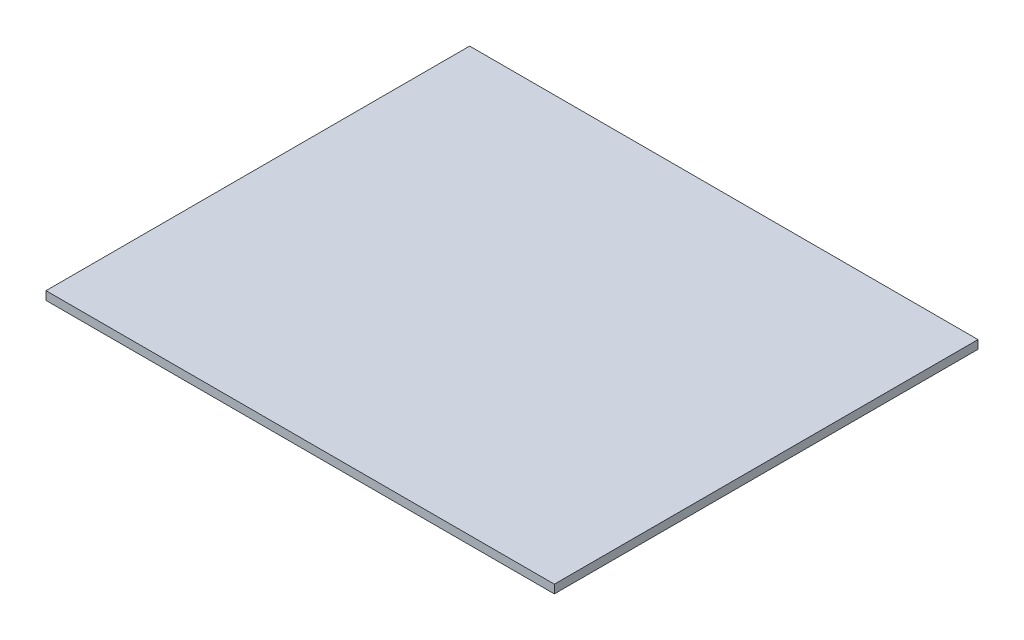
ISO-10303-21;
HEADER;
FILE_DESCRIPTION(('STEP AP214'),'2;1');
FILE_NAME('part.step','',(''),(''),'','','');
FILE_SCHEMA(('AUTOMOTIVE_DESIGN { 1 0 10303 214 1 1 1 1 }'));
ENDSEC;
DATA;
#1=APPLICATION_CONTEXT('core data for automotive mechanical design processes');
#2=APPLICATION_PROTOCOL_DEFINITION('international standard','automotive_design',2000,#1);
#3=PRODUCT_CONTEXT('',#1,'mechanical');
#4=PRODUCT('Part','Part','',(#3));
#5=PRODUCT_RELATED_PRODUCT_CATEGORY('part','',(#4));
#6=PRODUCT_DEFINITION_FORMATION('','',#4);
#7=PRODUCT_DEFINITION_CONTEXT('part definition',#1,'design');
#8=PRODUCT_DEFINITION('design','',#6,#7);
#9=PRODUCT_DEFINITION_SHAPE('','',#8);
#10=(LENGTH_UNIT() NAMED_UNIT(*) SI_UNIT(.MILLI.,.METRE.));
#11=(NAMED_UNIT(*) PLANE_ANGLE_UNIT() SI_UNIT($,.RADIAN.));
#12=(NAMED_UNIT(*) SI_UNIT($,.STERADIAN.) SOLID_ANGLE_UNIT());
#13=UNCERTAINTY_MEASURE_WITH_UNIT(LENGTH_MEASURE(1.E-05),#10,'distance_accuracy_value','');
#14=(GEOMETRIC_REPRESENTATION_CONTEXT(3) GLOBAL_UNCERTAINTY_ASSIGNED_CONTEXT((#13)) GLOBAL_UNIT_ASSIGNED_CONTEXT((#10,
#11,#12)) REPRESENTATION_CONTEXT('',''));
#15=CARTESIAN_POINT('',(0.,0.,0.));
#16=DIRECTION('',(0.,0.,1.));
#17=DIRECTION('',(1.,0.,0.));
#18=AXIS2_PLACEMENT_3D('',#15,#16,#17);
#19=CARTESIAN_POINT('',(-300.,10.,-250.));
#20=DIRECTION('',(1.,0.,0.));
#21=DIRECTION('',(0.,0.,-1.));
#22=AXIS2_PLACEMENT_3D('',#19,#20,#21);
#23=PLANE('',#22);
#24=DIRECTION('',(0.,0.,1.));
#25=VECTOR('',#24,1.);
#26=CARTESIAN_POINT('',(-300.,0.,-250.));
#27=LINE('',#26,#25);
#28=CARTESIAN_POINT('',(-300.,0.,-250.));
#29=VERTEX_POINT('',#28);
#30=CARTESIAN_POINT('',(-300.,0.,250.));
#31=VERTEX_POINT('',#30);
#32=EDGE_CURVE('E95',#29,#31,#27,.T.);
#33=ORIENTED_EDGE('',*,*,#32,.T.);
#34=DIRECTION('',(0.,-1.,0.));
#35=VECTOR('',#34,1.);
#36=CARTESIAN_POINT('',(-300.,10.,250.));
#37=LINE('',#36,#35);
#38=CARTESIAN_POINT('',(-300.,10.,250.));
#39=VERTEX_POINT('',#38);
#40=EDGE_CURVE('E11',#39,#31,#37,.T.);
#41=ORIENTED_EDGE('',*,*,#40,.F.);
#42=DIRECTION('',(0.,0.,1.));
#43=VECTOR('',#42,1.);
#44=CARTESIAN_POINT('',(-300.,10.,-250.));
#45=LINE('',#44,#43);
#46=CARTESIAN_POINT('',(-300.,10.,-250.));
#47=VERTEX_POINT('',#46);
#48=EDGE_CURVE('E81',#47,#39,#45,.T.);
#49=ORIENTED_EDGE('',*,*,#48,.F.);
#50=DIRECTION('',(0.,-1.,0.));
#51=VECTOR('',#50,1.);
#52=CARTESIAN_POINT('',(-300.,10.,-250.));
#53=LINE('',#52,#51);
#54=EDGE_CURVE('E48',#47,#29,#53,.T.);
#55=ORIENTED_EDGE('',*,*,#54,.T.);
#56=EDGE_LOOP('',(#33,#41,#49,#55));
#57=FACE_BOUND('',#56,.T.);
#58=ADVANCED_FACE('F32',(#57),#23,.F.);
#59=CARTESIAN_POINT('',(-300.,10.,250.));
#60=DIRECTION('',(0.,0.,-1.));
#61=DIRECTION('',(-1.,0.,0.));
#62=AXIS2_PLACEMENT_3D('',#59,#60,#61);
#63=PLANE('',#62);
#64=DIRECTION('',(1.,0.,0.));
#65=VECTOR('',#64,1.);
#66=CARTESIAN_POINT('',(-300.,0.,250.));
#67=LINE('',#66,#65);
#68=CARTESIAN_POINT('',(300.,0.,250.));
#69=VERTEX_POINT('',#68);
#70=EDGE_CURVE('E86',#31,#69,#67,.T.);
#71=ORIENTED_EDGE('',*,*,#70,.T.);
#72=DIRECTION('',(0.,-1.,0.));
#73=VECTOR('',#72,1.);
#74=CARTESIAN_POINT('',(300.,10.,250.));
#75=LINE('',#74,#73);
#76=CARTESIAN_POINT('',(300.,10.,250.));
#77=VERTEX_POINT('',#76);
#78=EDGE_CURVE('E40',#77,#69,#75,.T.);
#79=ORIENTED_EDGE('',*,*,#78,.F.);
#80=DIRECTION('',(1.,0.,0.));
#81=VECTOR('',#80,1.);
#82=CARTESIAN_POINT('',(-300.,10.,250.));
#83=LINE('',#82,#81);
#84=EDGE_CURVE('E73',#39,#77,#83,.T.);
#85=ORIENTED_EDGE('',*,*,#84,.F.);
#86=ORIENTED_EDGE('',*,*,#40,.T.);
#87=EDGE_LOOP('',(#71,#79,#85,#86));
#88=FACE_BOUND('',#87,.T.);
#89=ADVANCED_FACE('F85',(#88),#63,.F.);
#90=CARTESIAN_POINT('',(300.,10.,-250.));
#91=DIRECTION('',(1.,0.,0.));
#92=DIRECTION('',(0.,0.,-1.));
#93=AXIS2_PLACEMENT_3D('',#90,#91,#92);
#94=PLANE('',#93);
#95=DIRECTION('',(0.,0.,1.));
#96=VECTOR('',#95,1.);
#97=CARTESIAN_POINT('',(300.,0.,-250.));
#98=LINE('',#97,#96);
#99=CARTESIAN_POINT('',(300.,0.,-250.));
#100=VERTEX_POINT('',#99);
#101=EDGE_CURVE('E98',#100,#69,#98,.T.);
#102=ORIENTED_EDGE('',*,*,#101,.F.);
#103=DIRECTION('',(0.,-1.,0.));
#104=VECTOR('',#103,1.);
#105=CARTESIAN_POINT('',(300.,10.,-250.));
#106=LINE('',#105,#104);
#107=CARTESIAN_POINT('',(300.,10.,-250.));
#108=VERTEX_POINT('',#107);
#109=EDGE_CURVE('E62',#108,#100,#106,.T.);
#110=ORIENTED_EDGE('',*,*,#109,.F.);
#111=DIRECTION('',(0.,0.,1.));
#112=VECTOR('',#111,1.);
#113=CARTESIAN_POINT('',(300.,10.,-250.));
#114=LINE('',#113,#112);
#115=EDGE_CURVE('E80',#108,#77,#114,.T.);
#116=ORIENTED_EDGE('',*,*,#115,.T.);
#117=ORIENTED_EDGE('',*,*,#78,.T.);
#118=EDGE_LOOP('',(#102,#110,#116,#117));
#119=FACE_BOUND('',#118,.T.);
#120=ADVANCED_FACE('F89',(#119),#94,.T.);
#121=CARTESIAN_POINT('',(-300.,10.,-250.));
#122=DIRECTION('',(0.,0.,-1.));
#123=DIRECTION('',(-1.,0.,0.));
#124=AXIS2_PLACEMENT_3D('',#121,#122,#123);
#125=PLANE('',#124);
#126=DIRECTION('',(1.,0.,0.));
#127=VECTOR('',#126,1.);
#128=CARTESIAN_POINT('',(-300.,0.,-250.));
#129=LINE('',#128,#127);
#130=EDGE_CURVE('E100',#29,#100,#129,.T.);
#131=ORIENTED_EDGE('',*,*,#130,.F.);
#132=ORIENTED_EDGE('',*,*,#54,.F.);
#133=DIRECTION('',(1.,0.,0.));
#134=VECTOR('',#133,1.);
#135=CARTESIAN_POINT('',(-300.,10.,-250.));
#136=LINE('',#135,#134);
#137=EDGE_CURVE('E90',#47,#108,#136,.T.);
#138=ORIENTED_EDGE('',*,*,#137,.T.);
#139=ORIENTED_EDGE('',*,*,#109,.T.);
#140=EDGE_LOOP('',(#131,#132,#138,#139));
#141=FACE_BOUND('',#140,.T.);
#142=ADVANCED_FACE('F106',(#141),#125,.T.);
#143=CARTESIAN_POINT('',(0.,10.,0.));
#144=DIRECTION('',(0.,1.,0.));
#145=DIRECTION('',(0.,0.,1.));
#146=AXIS2_PLACEMENT_3D('',#143,#144,#145);
#147=PLANE('',#146);
#148=ORIENTED_EDGE('',*,*,#48,.T.);
#149=ORIENTED_EDGE('',*,*,#84,.T.);
#150=ORIENTED_EDGE('',*,*,#115,.F.);
#151=ORIENTED_EDGE('',*,*,#137,.F.);
#152=EDGE_LOOP('',(#148,#149,#150,#151));
#153=FACE_BOUND('',#152,.T.);
#154=ADVANCED_FACE('F77',(#153),#147,.T.);
#155=CARTESIAN_POINT('',(0.,0.,0.));
#156=DIRECTION('',(0.,1.,0.));
#157=DIRECTION('',(0.,0.,1.));
#158=AXIS2_PLACEMENT_3D('',#155,#156,#157);
#159=PLANE('',#158);
#160=ORIENTED_EDGE('',*,*,#32,.F.);
#161=ORIENTED_EDGE('',*,*,#130,.T.);
#162=ORIENTED_EDGE('',*,*,#101,.T.);
#163=ORIENTED_EDGE('',*,*,#70,.F.);
#164=EDGE_LOOP('',(#160,#161,#162,#163));
#165=FACE_BOUND('',#164,.T.);
#166=ADVANCED_FACE('F105',(#165),#159,.F.);
#167=CLOSED_SHELL('',(#58,#89,#120,#142,#154,#166));
#168=MANIFOLD_SOLID_BREP('B2',#167);
#169=ADVANCED_BREP_SHAPE_REPRESENTATION('',(#18,#168),#14);
#170=SHAPE_DEFINITION_REPRESENTATION(#9,#169);
ENDSEC;
END-ISO-10303-21;
